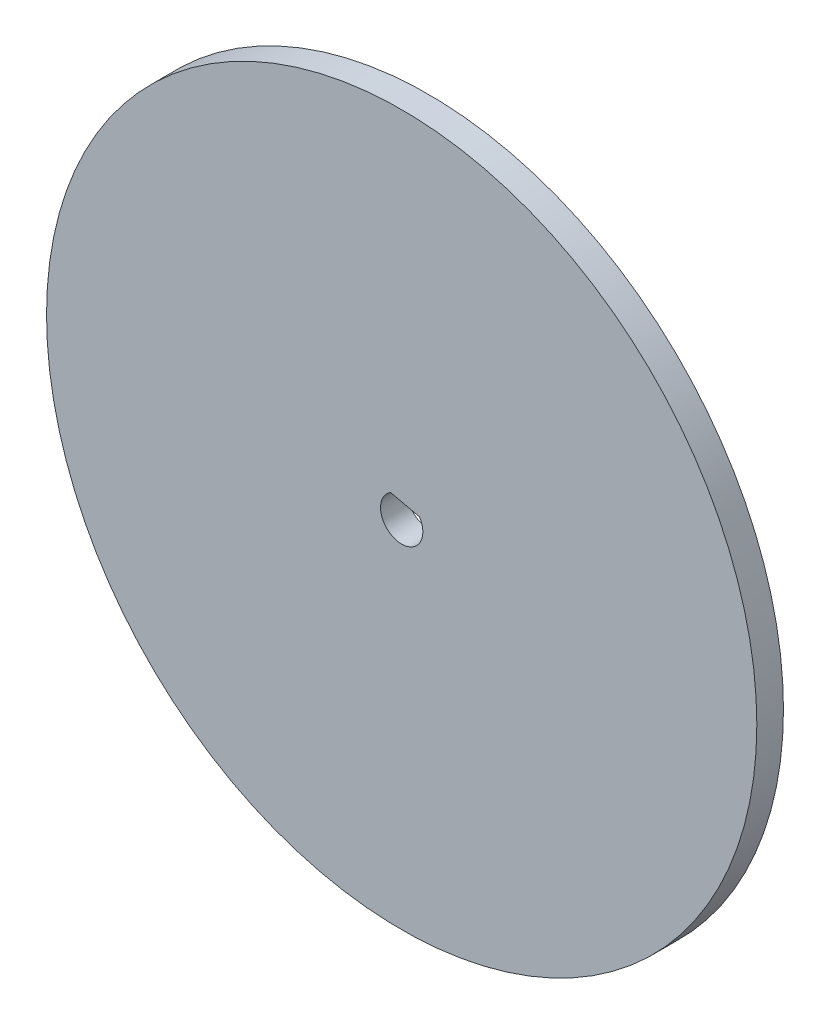
ISO-10303-21;
HEADER;
FILE_DESCRIPTION(('STEP AP214'),'2;1');
FILE_NAME('part.step','',(''),(''),'','','');
FILE_SCHEMA(('AUTOMOTIVE_DESIGN { 1 0 10303 214 1 1 1 1 }'));
ENDSEC;
DATA;
#1=APPLICATION_CONTEXT('core data for automotive mechanical design processes');
#2=APPLICATION_PROTOCOL_DEFINITION('international standard','automotive_design',2000,#1);
#3=PRODUCT_CONTEXT('',#1,'mechanical');
#4=PRODUCT('Part','Part','',(#3));
#5=PRODUCT_RELATED_PRODUCT_CATEGORY('part','',(#4));
#6=PRODUCT_DEFINITION_FORMATION('','',#4);
#7=PRODUCT_DEFINITION_CONTEXT('part definition',#1,'design');
#8=PRODUCT_DEFINITION('design','',#6,#7);
#9=PRODUCT_DEFINITION_SHAPE('','',#8);
#10=(LENGTH_UNIT() NAMED_UNIT(*) SI_UNIT(.MILLI.,.METRE.));
#11=(NAMED_UNIT(*) PLANE_ANGLE_UNIT() SI_UNIT($,.RADIAN.));
#12=(NAMED_UNIT(*) SI_UNIT($,.STERADIAN.) SOLID_ANGLE_UNIT());
#13=UNCERTAINTY_MEASURE_WITH_UNIT(LENGTH_MEASURE(1.E-05),#10,'distance_accuracy_value','');
#14=(GEOMETRIC_REPRESENTATION_CONTEXT(3) GLOBAL_UNCERTAINTY_ASSIGNED_CONTEXT((#13)) GLOBAL_UNIT_ASSIGNED_CONTEXT((#10,
#11,#12)) REPRESENTATION_CONTEXT('',''));
#15=CARTESIAN_POINT('',(0.,0.,0.));
#16=DIRECTION('',(0.,0.,1.));
#17=DIRECTION('',(1.,0.,0.));
#18=AXIS2_PLACEMENT_3D('',#15,#16,#17);
#19=CARTESIAN_POINT('',(0.,0.,3.));
#20=DIRECTION('',(0.,0.,-1.));
#21=DIRECTION('',(-1.,0.,0.));
#22=AXIS2_PLACEMENT_3D('',#19,#20,#21);
#23=CYLINDRICAL_SURFACE('',#22,40.);
#24=CARTESIAN_POINT('',(0.,0.,3.));
#25=DIRECTION('',(0.,0.,1.));
#26=DIRECTION('',(1.,0.,0.));
#27=AXIS2_PLACEMENT_3D('',#24,#25,#26);
#28=CIRCLE('',#27,40.);
#29=CARTESIAN_POINT('',(40.,0.,3.));
#30=VERTEX_POINT('',#29);
#31=EDGE_CURVE('E11',#30,#30,#28,.T.);
#32=ORIENTED_EDGE('',*,*,#31,.F.);
#33=EDGE_LOOP('',(#32));
#34=FACE_BOUND('',#33,.T.);
#35=CARTESIAN_POINT('',(0.,0.,0.));
#36=DIRECTION('',(0.,0.,1.));
#37=DIRECTION('',(1.,0.,0.));
#38=AXIS2_PLACEMENT_3D('',#35,#36,#37);
#39=CIRCLE('',#38,40.);
#40=CARTESIAN_POINT('',(40.,0.,0.));
#41=VERTEX_POINT('',#40);
#42=EDGE_CURVE('E35',#41,#41,#39,.T.);
#43=ORIENTED_EDGE('',*,*,#42,.T.);
#44=EDGE_LOOP('',(#43));
#45=FACE_BOUND('',#44,.T.);
#46=ADVANCED_FACE('F32',(#34,#45),#23,.T.);
#47=CARTESIAN_POINT('',(0.,0.,3.));
#48=DIRECTION('',(0.,0.,1.));
#49=DIRECTION('',(1.,0.,0.));
#50=AXIS2_PLACEMENT_3D('',#47,#48,#49);
#51=PLANE('',#50);
#52=CARTESIAN_POINT('',(0.,0.,3.));
#53=DIRECTION('',(0.,0.,1.));
#54=DIRECTION('',(1.,0.,0.));
#55=AXIS2_PLACEMENT_3D('',#52,#53,#54);
#56=CIRCLE('',#55,2.38125);
#57=CARTESIAN_POINT('',(-1.24923869858208,2.02725287925926,3.));
#58=VERTEX_POINT('',#57);
#59=CARTESIAN_POINT('',(2.00666826094724,1.2820429216711,3.));
#60=VERTEX_POINT('',#59);
#61=EDGE_CURVE('E46',#58,#60,#56,.T.);
#62=ORIENTED_EDGE('',*,*,#61,.F.);
#63=DIRECTION('',(0.974793257545978,-0.223110073826579,0.));
#64=VECTOR('',#63,1.);
#65=CARTESIAN_POINT('',(-1.24923869858208,2.02725287925926,3.));
#66=LINE('',#65,#64);
#67=EDGE_CURVE('E65',#58,#60,#66,.T.);
#68=ORIENTED_EDGE('',*,*,#67,.T.);
#69=EDGE_LOOP('',(#62,#68));
#70=FACE_BOUND('',#69,.T.);
#71=ORIENTED_EDGE('',*,*,#31,.T.);
#72=EDGE_LOOP('',(#71));
#73=FACE_BOUND('',#72,.T.);
#74=ADVANCED_FACE('F69',(#70,#73),#51,.T.);
#75=CARTESIAN_POINT('',(0.,0.,0.));
#76=DIRECTION('',(0.,0.,1.));
#77=DIRECTION('',(1.,0.,0.));
#78=AXIS2_PLACEMENT_3D('',#75,#76,#77);
#79=PLANE('',#78);
#80=DIRECTION('',(0.974793257545978,-0.223110073826579,0.));
#81=VECTOR('',#80,1.);
#82=CARTESIAN_POINT('',(-1.24923869858208,2.02725287925926,0.));
#83=LINE('',#82,#81);
#84=CARTESIAN_POINT('',(-1.24923869858208,2.02725287925926,0.));
#85=VERTEX_POINT('',#84);
#86=CARTESIAN_POINT('',(2.00666826094724,1.2820429216711,0.));
#87=VERTEX_POINT('',#86);
#88=EDGE_CURVE('E73',#85,#87,#83,.T.);
#89=ORIENTED_EDGE('',*,*,#88,.F.);
#90=CARTESIAN_POINT('',(0.,0.,0.));
#91=DIRECTION('',(0.,0.,1.));
#92=DIRECTION('',(1.,0.,0.));
#93=AXIS2_PLACEMENT_3D('',#90,#91,#92);
#94=CIRCLE('',#93,2.38125);
#95=EDGE_CURVE('E51',#85,#87,#94,.T.);
#96=ORIENTED_EDGE('',*,*,#95,.T.);
#97=EDGE_LOOP('',(#89,#96));
#98=FACE_BOUND('',#97,.T.);
#99=ORIENTED_EDGE('',*,*,#42,.F.);
#100=EDGE_LOOP('',(#99));
#101=FACE_BOUND('',#100,.T.);
#102=ADVANCED_FACE('F77',(#98,#101),#79,.F.);
#103=CARTESIAN_POINT('',(0.,0.,0.));
#104=DIRECTION('',(0.,0.,1.));
#105=DIRECTION('',(1.,0.,0.));
#106=AXIS2_PLACEMENT_3D('',#103,#104,#105);
#107=CYLINDRICAL_SURFACE('',#106,2.38125);
#108=ORIENTED_EDGE('',*,*,#61,.T.);
#109=DIRECTION('',(0.,0.,1.));
#110=VECTOR('',#109,1.);
#111=CARTESIAN_POINT('',(2.00666826094724,1.2820429216711,0.));
#112=LINE('',#111,#110);
#113=EDGE_CURVE('E62',#87,#60,#112,.T.);
#114=ORIENTED_EDGE('',*,*,#113,.F.);
#115=ORIENTED_EDGE('',*,*,#95,.F.);
#116=DIRECTION('',(0.,0.,1.));
#117=VECTOR('',#116,1.);
#118=CARTESIAN_POINT('',(-1.24923869858208,2.02725287925926,0.));
#119=LINE('',#118,#117);
#120=EDGE_CURVE('E57',#85,#58,#119,.T.);
#121=ORIENTED_EDGE('',*,*,#120,.T.);
#122=EDGE_LOOP('',(#108,#114,#115,#121));
#123=FACE_BOUND('',#122,.T.);
#124=ADVANCED_FACE('F59',(#123),#107,.F.);
#125=CARTESIAN_POINT('',(-1.24923869858208,2.02725287925926,0.));
#126=DIRECTION('',(-0.223110073826579,-0.974793257545978,0.));
#127=DIRECTION('',(0.974793257545978,-0.223110073826579,0.));
#128=AXIS2_PLACEMENT_3D('',#125,#126,#127);
#129=PLANE('',#128);
#130=ORIENTED_EDGE('',*,*,#67,.F.);
#131=ORIENTED_EDGE('',*,*,#120,.F.);
#132=ORIENTED_EDGE('',*,*,#88,.T.);
#133=ORIENTED_EDGE('',*,*,#113,.T.);
#134=EDGE_LOOP('',(#130,#131,#132,#133));
#135=FACE_BOUND('',#134,.T.);
#136=ADVANCED_FACE('F66',(#135),#129,.T.);
#137=CLOSED_SHELL('',(#46,#74,#102,#124,#136));
#138=MANIFOLD_SOLID_BREP('B2',#137);
#139=ADVANCED_BREP_SHAPE_REPRESENTATION('',(#18,#138),#14);
#140=SHAPE_DEFINITION_REPRESENTATION(#9,#139);
ENDSEC;
END-ISO-10303-21;
